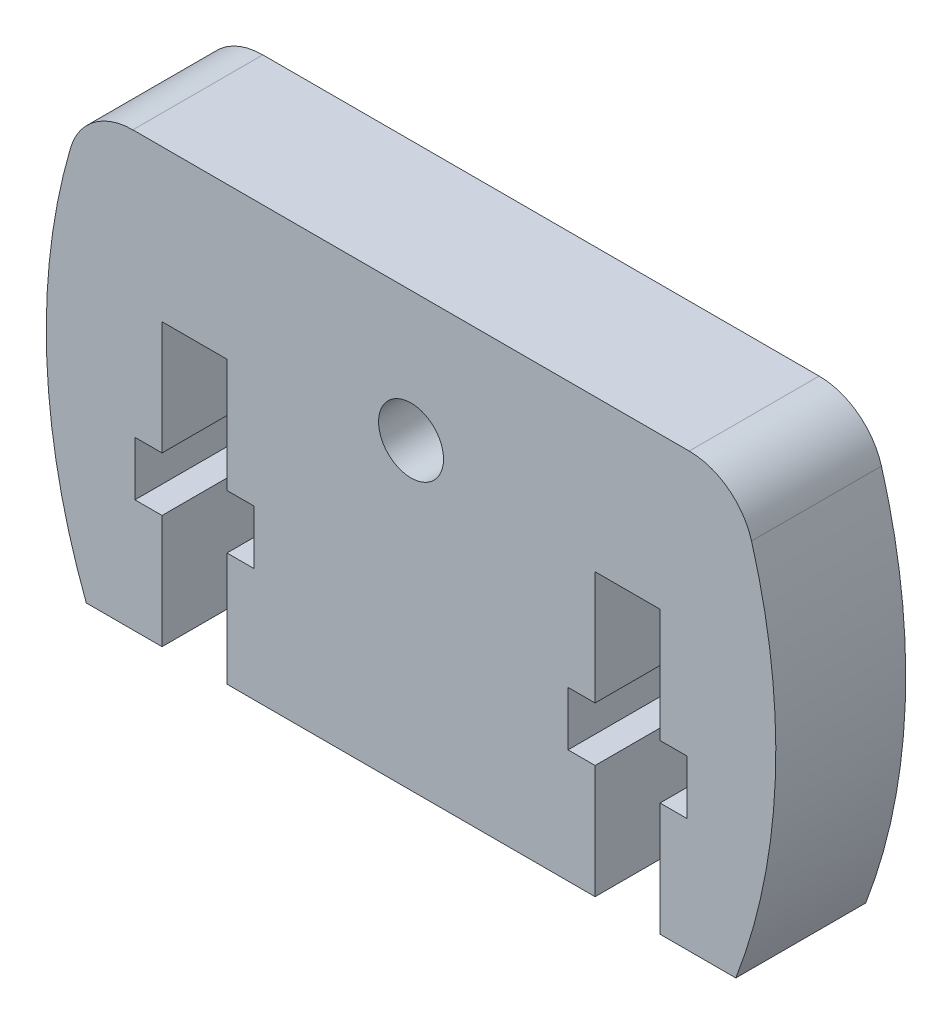
ISO-10303-21;
HEADER;
FILE_DESCRIPTION(('STEP AP214'),'2;1');
FILE_NAME('part.step','',(''),(''),'','','');
FILE_SCHEMA(('AUTOMOTIVE_DESIGN { 1 0 10303 214 1 1 1 1 }'));
ENDSEC;
DATA;
#1=APPLICATION_CONTEXT('core data for automotive mechanical design processes');
#2=APPLICATION_PROTOCOL_DEFINITION('international standard','automotive_design',2000,#1);
#3=PRODUCT_CONTEXT('',#1,'mechanical');
#4=PRODUCT('Part','Part','',(#3));
#5=PRODUCT_RELATED_PRODUCT_CATEGORY('part','',(#4));
#6=PRODUCT_DEFINITION_FORMATION('','',#4);
#7=PRODUCT_DEFINITION_CONTEXT('part definition',#1,'design');
#8=PRODUCT_DEFINITION('design','',#6,#7);
#9=PRODUCT_DEFINITION_SHAPE('','',#8);
#10=(LENGTH_UNIT() NAMED_UNIT(*) SI_UNIT(.MILLI.,.METRE.));
#11=(NAMED_UNIT(*) PLANE_ANGLE_UNIT() SI_UNIT($,.RADIAN.));
#12=(NAMED_UNIT(*) SI_UNIT($,.STERADIAN.) SOLID_ANGLE_UNIT());
#13=UNCERTAINTY_MEASURE_WITH_UNIT(LENGTH_MEASURE(1.E-05),#10,'distance_accuracy_value','');
#14=(GEOMETRIC_REPRESENTATION_CONTEXT(3) GLOBAL_UNCERTAINTY_ASSIGNED_CONTEXT((#13)) GLOBAL_UNIT_ASSIGNED_CONTEXT((#10,
#11,#12)) REPRESENTATION_CONTEXT('',''));
#15=CARTESIAN_POINT('',(0.,0.,0.));
#16=DIRECTION('',(0.,0.,1.));
#17=DIRECTION('',(1.,0.,0.));
#18=AXIS2_PLACEMENT_3D('',#15,#16,#17);
#19=CARTESIAN_POINT('',(26.1482162698119,10.,6.));
#20=DIRECTION('',(0.,0.,-1.));
#21=DIRECTION('',(-1.,0.,0.));
#22=AXIS2_PLACEMENT_3D('',#19,#20,#21);
#23=PLANE('',#22);
#24=CARTESIAN_POINT('',(26.1482162698119,10.,6.));
#25=DIRECTION('',(0.,0.,1.));
#26=DIRECTION('',(-1.,0.,0.));
#27=AXIS2_PLACEMENT_3D('',#24,#25,#26);
#28=CIRCLE('',#27,27.99516411977);
#29=CARTESIAN_POINT('',(-0.726698907722935,17.8401625170122,6.));
#30=VERTEX_POINT('',#29);
#31=CARTESIAN_POINT('',(0.,0.,6.));
#32=VERTEX_POINT('',#31);
#33=EDGE_CURVE('E362',#30,#32,#28,.T.);
#34=ORIENTED_EDGE('',*,*,#33,.T.);
#35=DIRECTION('',(1.,0.,0.));
#36=VECTOR('',#35,1.);
#37=CARTESIAN_POINT('',(0.,0.,6.));
#38=LINE('',#37,#36);
#39=CARTESIAN_POINT('',(3.5,0.,6.));
#40=VERTEX_POINT('',#39);
#41=EDGE_CURVE('E166',#32,#40,#38,.T.);
#42=ORIENTED_EDGE('',*,*,#41,.T.);
#43=DIRECTION('',(0.,1.,0.));
#44=VECTOR('',#43,1.);
#45=CARTESIAN_POINT('',(3.5,0.,6.));
#46=LINE('',#45,#44);
#47=CARTESIAN_POINT('',(3.5,5.25,6.));
#48=VERTEX_POINT('',#47);
#49=EDGE_CURVE('E471',#40,#48,#46,.T.);
#50=ORIENTED_EDGE('',*,*,#49,.T.);
#51=DIRECTION('',(-1.,0.,0.));
#52=VECTOR('',#51,1.);
#53=CARTESIAN_POINT('',(3.5,5.25,6.));
#54=LINE('',#53,#52);
#55=CARTESIAN_POINT('',(2.25,5.25,6.));
#56=VERTEX_POINT('',#55);
#57=EDGE_CURVE('E491',#48,#56,#54,.T.);
#58=ORIENTED_EDGE('',*,*,#57,.T.);
#59=DIRECTION('',(0.,1.,0.));
#60=VECTOR('',#59,1.);
#61=CARTESIAN_POINT('',(2.25,5.25,6.));
#62=LINE('',#61,#60);
#63=CARTESIAN_POINT('',(2.25,7.75,6.));
#64=VERTEX_POINT('',#63);
#65=EDGE_CURVE('E487',#56,#64,#62,.T.);
#66=ORIENTED_EDGE('',*,*,#65,.T.);
#67=DIRECTION('',(1.,0.,0.));
#68=VECTOR('',#67,1.);
#69=CARTESIAN_POINT('',(2.25,7.75,6.));
#70=LINE('',#69,#68);
#71=CARTESIAN_POINT('',(3.5,7.75,6.));
#72=VERTEX_POINT('',#71);
#73=EDGE_CURVE('E490',#64,#72,#70,.T.);
#74=ORIENTED_EDGE('',*,*,#73,.T.);
#75=DIRECTION('',(0.,1.,0.));
#76=VECTOR('',#75,1.);
#77=CARTESIAN_POINT('',(3.5,7.75,6.));
#78=LINE('',#77,#76);
#79=CARTESIAN_POINT('',(3.5,13.,6.));
#80=VERTEX_POINT('',#79);
#81=EDGE_CURVE('E495',#72,#80,#78,.T.);
#82=ORIENTED_EDGE('',*,*,#81,.T.);
#83=DIRECTION('',(1.,0.,0.));
#84=VECTOR('',#83,1.);
#85=CARTESIAN_POINT('',(3.5,13.,6.));
#86=LINE('',#85,#84);
#87=CARTESIAN_POINT('',(6.5,13.,6.));
#88=VERTEX_POINT('',#87);
#89=EDGE_CURVE('E502',#80,#88,#86,.T.);
#90=ORIENTED_EDGE('',*,*,#89,.T.);
#91=DIRECTION('',(0.,-1.,0.));
#92=VECTOR('',#91,1.);
#93=CARTESIAN_POINT('',(6.5,7.75,6.));
#94=LINE('',#93,#92);
#95=CARTESIAN_POINT('',(6.5,7.75,6.));
#96=VERTEX_POINT('',#95);
#97=EDGE_CURVE('E505',#88,#96,#94,.T.);
#98=ORIENTED_EDGE('',*,*,#97,.T.);
#99=DIRECTION('',(1.,0.,0.));
#100=VECTOR('',#99,1.);
#101=CARTESIAN_POINT('',(7.75,7.75,6.));
#102=LINE('',#101,#100);
#103=CARTESIAN_POINT('',(7.75,7.75,6.));
#104=VERTEX_POINT('',#103);
#105=EDGE_CURVE('E508',#96,#104,#102,.T.);
#106=ORIENTED_EDGE('',*,*,#105,.T.);
#107=DIRECTION('',(0.,-1.,0.));
#108=VECTOR('',#107,1.);
#109=CARTESIAN_POINT('',(7.75,5.25,6.));
#110=LINE('',#109,#108);
#111=CARTESIAN_POINT('',(7.75,5.25,6.));
#112=VERTEX_POINT('',#111);
#113=EDGE_CURVE('E511',#104,#112,#110,.T.);
#114=ORIENTED_EDGE('',*,*,#113,.T.);
#115=DIRECTION('',(-1.,0.,0.));
#116=VECTOR('',#115,1.);
#117=CARTESIAN_POINT('',(6.5,5.25,6.));
#118=LINE('',#117,#116);
#119=CARTESIAN_POINT('',(6.5,5.25,6.));
#120=VERTEX_POINT('',#119);
#121=EDGE_CURVE('E514',#112,#120,#118,.T.);
#122=ORIENTED_EDGE('',*,*,#121,.T.);
#123=DIRECTION('',(0.,-1.,0.));
#124=VECTOR('',#123,1.);
#125=CARTESIAN_POINT('',(6.5,0.,6.));
#126=LINE('',#125,#124);
#127=CARTESIAN_POINT('',(6.5,0.,6.));
#128=VERTEX_POINT('',#127);
#129=EDGE_CURVE('E517',#120,#128,#126,.T.);
#130=ORIENTED_EDGE('',*,*,#129,.T.);
#131=DIRECTION('',(1.,0.,0.));
#132=VECTOR('',#131,1.);
#133=CARTESIAN_POINT('',(6.5,0.,6.));
#134=LINE('',#133,#132);
#135=CARTESIAN_POINT('',(23.5,0.,6.));
#136=VERTEX_POINT('',#135);
#137=EDGE_CURVE('E520',#128,#136,#134,.T.);
#138=ORIENTED_EDGE('',*,*,#137,.T.);
#139=DIRECTION('',(0.,1.,0.));
#140=VECTOR('',#139,1.);
#141=CARTESIAN_POINT('',(23.5,0.,6.));
#142=LINE('',#141,#140);
#143=CARTESIAN_POINT('',(23.5,5.25,6.));
#144=VERTEX_POINT('',#143);
#145=EDGE_CURVE('E523',#136,#144,#142,.T.);
#146=ORIENTED_EDGE('',*,*,#145,.T.);
#147=DIRECTION('',(-1.,0.,0.));
#148=VECTOR('',#147,1.);
#149=CARTESIAN_POINT('',(23.5,5.25,6.));
#150=LINE('',#149,#148);
#151=CARTESIAN_POINT('',(22.25,5.25,6.));
#152=VERTEX_POINT('',#151);
#153=EDGE_CURVE('E526',#144,#152,#150,.T.);
#154=ORIENTED_EDGE('',*,*,#153,.T.);
#155=DIRECTION('',(0.,1.,0.));
#156=VECTOR('',#155,1.);
#157=CARTESIAN_POINT('',(22.25,5.25,6.));
#158=LINE('',#157,#156);
#159=CARTESIAN_POINT('',(22.25,7.75,6.));
#160=VERTEX_POINT('',#159);
#161=EDGE_CURVE('E529',#152,#160,#158,.T.);
#162=ORIENTED_EDGE('',*,*,#161,.T.);
#163=DIRECTION('',(1.,0.,0.));
#164=VECTOR('',#163,1.);
#165=CARTESIAN_POINT('',(22.25,7.75,6.));
#166=LINE('',#165,#164);
#167=CARTESIAN_POINT('',(23.5,7.75,6.));
#168=VERTEX_POINT('',#167);
#169=EDGE_CURVE('E532',#160,#168,#166,.T.);
#170=ORIENTED_EDGE('',*,*,#169,.T.);
#171=DIRECTION('',(0.,1.,0.));
#172=VECTOR('',#171,1.);
#173=CARTESIAN_POINT('',(23.5,7.75,6.));
#174=LINE('',#173,#172);
#175=CARTESIAN_POINT('',(23.5,13.,6.));
#176=VERTEX_POINT('',#175);
#177=EDGE_CURVE('E535',#168,#176,#174,.T.);
#178=ORIENTED_EDGE('',*,*,#177,.T.);
#179=DIRECTION('',(1.,0.,0.));
#180=VECTOR('',#179,1.);
#181=CARTESIAN_POINT('',(26.5,13.,6.));
#182=LINE('',#181,#180);
#183=CARTESIAN_POINT('',(26.5,13.,6.));
#184=VERTEX_POINT('',#183);
#185=EDGE_CURVE('E538',#176,#184,#182,.T.);
#186=ORIENTED_EDGE('',*,*,#185,.T.);
#187=DIRECTION('',(0.,-1.,0.));
#188=VECTOR('',#187,1.);
#189=CARTESIAN_POINT('',(26.5,7.75,6.));
#190=LINE('',#189,#188);
#191=CARTESIAN_POINT('',(26.5,7.75,6.));
#192=VERTEX_POINT('',#191);
#193=EDGE_CURVE('E541',#184,#192,#190,.T.);
#194=ORIENTED_EDGE('',*,*,#193,.T.);
#195=DIRECTION('',(1.,0.,0.));
#196=VECTOR('',#195,1.);
#197=CARTESIAN_POINT('',(27.75,7.75,6.));
#198=LINE('',#197,#196);
#199=CARTESIAN_POINT('',(27.75,7.75,6.));
#200=VERTEX_POINT('',#199);
#201=EDGE_CURVE('E544',#192,#200,#198,.T.);
#202=ORIENTED_EDGE('',*,*,#201,.T.);
#203=DIRECTION('',(0.,-1.,0.));
#204=VECTOR('',#203,1.);
#205=CARTESIAN_POINT('',(27.75,5.25,6.));
#206=LINE('',#205,#204);
#207=CARTESIAN_POINT('',(27.75,5.25,6.));
#208=VERTEX_POINT('',#207);
#209=EDGE_CURVE('E547',#200,#208,#206,.T.);
#210=ORIENTED_EDGE('',*,*,#209,.T.);
#211=DIRECTION('',(-1.,0.,0.));
#212=VECTOR('',#211,1.);
#213=CARTESIAN_POINT('',(26.5,5.25,6.));
#214=LINE('',#213,#212);
#215=CARTESIAN_POINT('',(26.5,5.25,6.));
#216=VERTEX_POINT('',#215);
#217=EDGE_CURVE('E550',#208,#216,#214,.T.);
#218=ORIENTED_EDGE('',*,*,#217,.T.);
#219=DIRECTION('',(0.,-1.,0.));
#220=VECTOR('',#219,1.);
#221=CARTESIAN_POINT('',(26.5,0.,6.));
#222=LINE('',#221,#220);
#223=CARTESIAN_POINT('',(26.5,0.,6.));
#224=VERTEX_POINT('',#223);
#225=EDGE_CURVE('E553',#216,#224,#222,.T.);
#226=ORIENTED_EDGE('',*,*,#225,.T.);
#227=DIRECTION('',(1.,0.,0.));
#228=VECTOR('',#227,1.);
#229=CARTESIAN_POINT('',(26.5,0.,6.));
#230=LINE('',#229,#228);
#231=CARTESIAN_POINT('',(30.,0.,6.));
#232=VERTEX_POINT('',#231);
#233=EDGE_CURVE('E556',#224,#232,#230,.T.);
#234=ORIENTED_EDGE('',*,*,#233,.T.);
#235=CARTESIAN_POINT('',(3.85178373018806,10.,6.));
#236=DIRECTION('',(0.,0.,1.));
#237=DIRECTION('',(1.,0.,0.));
#238=AXIS2_PLACEMENT_3D('',#235,#236,#237);
#239=CIRCLE('',#238,27.99516411977);
#240=CARTESIAN_POINT('',(30.7266989077229,17.8401625170122,6.));
#241=VERTEX_POINT('',#240);
#242=EDGE_CURVE('E251',#232,#241,#239,.T.);
#243=ORIENTED_EDGE('',*,*,#242,.T.);
#244=CARTESIAN_POINT('',(27.8467463134937,17.,6.));
#245=DIRECTION('',(0.,0.,1.));
#246=DIRECTION('',(-1.,0.,0.));
#247=AXIS2_PLACEMENT_3D('',#244,#245,#246);
#248=CIRCLE('',#247,3.);
#249=CARTESIAN_POINT('',(27.8467463134937,20.,6.));
#250=VERTEX_POINT('',#249);
#251=EDGE_CURVE('E245',#241,#250,#248,.T.);
#252=ORIENTED_EDGE('',*,*,#251,.T.);
#253=DIRECTION('',(-1.,0.,0.));
#254=VECTOR('',#253,1.);
#255=CARTESIAN_POINT('',(2.15325368650629,20.,6.));
#256=LINE('',#255,#254);
#257=CARTESIAN_POINT('',(2.15325368650629,20.,6.));
#258=VERTEX_POINT('',#257);
#259=EDGE_CURVE('E249',#250,#258,#256,.T.);
#260=ORIENTED_EDGE('',*,*,#259,.T.);
#261=CARTESIAN_POINT('',(2.15325368650629,17.,6.));
#262=DIRECTION('',(0.,0.,1.));
#263=DIRECTION('',(1.,0.,0.));
#264=AXIS2_PLACEMENT_3D('',#261,#262,#263);
#265=CIRCLE('',#264,3.);
#266=EDGE_CURVE('E57',#258,#30,#265,.T.);
#267=ORIENTED_EDGE('',*,*,#266,.T.);
#268=EDGE_LOOP('',(#34,#42,#50,#58,#66,#74,#82,#90,#98,#106,#114,#122,#130,#138,#146,#154,#162,
#170,#178,#186,#194,#202,#210,#218,#226,#234,#243,#252,#260,#267));
#269=FACE_BOUND('',#268,.T.);
#270=CARTESIAN_POINT('',(15.,14.,6.));
#271=DIRECTION('',(0.,0.,1.));
#272=DIRECTION('',(1.,0.,0.));
#273=AXIS2_PLACEMENT_3D('',#270,#271,#272);
#274=CIRCLE('',#273,1.5);
#275=CARTESIAN_POINT('',(16.5,14.,6.));
#276=VERTEX_POINT('',#275);
#277=EDGE_CURVE('E278',#276,#276,#274,.T.);
#278=ORIENTED_EDGE('',*,*,#277,.F.);
#279=EDGE_LOOP('',(#278));
#280=FACE_BOUND('',#279,.T.);
#281=ADVANCED_FACE('F39',(#269,#280),#23,.F.);
#282=CARTESIAN_POINT('',(26.1482162698119,10.,0.));
#283=DIRECTION('',(0.,0.,-1.));
#284=DIRECTION('',(-1.,0.,0.));
#285=AXIS2_PLACEMENT_3D('',#282,#283,#284);
#286=PLANE('',#285);
#287=CARTESIAN_POINT('',(26.1482162698119,10.,0.));
#288=DIRECTION('',(0.,0.,1.));
#289=DIRECTION('',(-1.,0.,0.));
#290=AXIS2_PLACEMENT_3D('',#287,#288,#289);
#291=CIRCLE('',#290,27.99516411977);
#292=CARTESIAN_POINT('',(-0.726698907722935,17.8401625170122,0.));
#293=VERTEX_POINT('',#292);
#294=CARTESIAN_POINT('',(0.,0.,0.));
#295=VERTEX_POINT('',#294);
#296=EDGE_CURVE('E273',#293,#295,#291,.T.);
#297=ORIENTED_EDGE('',*,*,#296,.F.);
#298=CARTESIAN_POINT('',(2.15325368650629,17.,0.));
#299=DIRECTION('',(0.,0.,1.));
#300=DIRECTION('',(1.,0.,0.));
#301=AXIS2_PLACEMENT_3D('',#298,#299,#300);
#302=CIRCLE('',#301,3.);
#303=CARTESIAN_POINT('',(2.15325368650629,20.,0.));
#304=VERTEX_POINT('',#303);
#305=EDGE_CURVE('E158',#304,#293,#302,.T.);
#306=ORIENTED_EDGE('',*,*,#305,.F.);
#307=DIRECTION('',(-1.,0.,0.));
#308=VECTOR('',#307,1.);
#309=CARTESIAN_POINT('',(2.15325368650629,20.,0.));
#310=LINE('',#309,#308);
#311=CARTESIAN_POINT('',(27.8467463134937,20.,0.));
#312=VERTEX_POINT('',#311);
#313=EDGE_CURVE('E152',#312,#304,#310,.T.);
#314=ORIENTED_EDGE('',*,*,#313,.F.);
#315=CARTESIAN_POINT('',(27.8467463134937,17.,0.));
#316=DIRECTION('',(0.,0.,1.));
#317=DIRECTION('',(-1.,0.,0.));
#318=AXIS2_PLACEMENT_3D('',#315,#316,#317);
#319=CIRCLE('',#318,3.);
#320=CARTESIAN_POINT('',(30.7266989077229,17.8401625170122,0.));
#321=VERTEX_POINT('',#320);
#322=EDGE_CURVE('E260',#321,#312,#319,.T.);
#323=ORIENTED_EDGE('',*,*,#322,.F.);
#324=CARTESIAN_POINT('',(3.85178373018806,10.,0.));
#325=DIRECTION('',(0.,0.,1.));
#326=DIRECTION('',(1.,0.,0.));
#327=AXIS2_PLACEMENT_3D('',#324,#325,#326);
#328=CIRCLE('',#327,27.99516411977);
#329=CARTESIAN_POINT('',(30.,0.,0.));
#330=VERTEX_POINT('',#329);
#331=EDGE_CURVE('E353',#330,#321,#328,.T.);
#332=ORIENTED_EDGE('',*,*,#331,.F.);
#333=DIRECTION('',(1.,0.,0.));
#334=VECTOR('',#333,1.);
#335=CARTESIAN_POINT('',(26.5,0.,0.));
#336=LINE('',#335,#334);
#337=CARTESIAN_POINT('',(26.5,0.,0.));
#338=VERTEX_POINT('',#337);
#339=EDGE_CURVE('E350',#338,#330,#336,.T.);
#340=ORIENTED_EDGE('',*,*,#339,.F.);
#341=DIRECTION('',(0.,-1.,0.));
#342=VECTOR('',#341,1.);
#343=CARTESIAN_POINT('',(26.5,0.,0.));
#344=LINE('',#343,#342);
#345=CARTESIAN_POINT('',(26.5,5.25,0.));
#346=VERTEX_POINT('',#345);
#347=EDGE_CURVE('E347',#346,#338,#344,.T.);
#348=ORIENTED_EDGE('',*,*,#347,.F.);
#349=DIRECTION('',(-1.,0.,0.));
#350=VECTOR('',#349,1.);
#351=CARTESIAN_POINT('',(26.5,5.25,0.));
#352=LINE('',#351,#350);
#353=CARTESIAN_POINT('',(27.75,5.25,0.));
#354=VERTEX_POINT('',#353);
#355=EDGE_CURVE('E344',#354,#346,#352,.T.);
#356=ORIENTED_EDGE('',*,*,#355,.F.);
#357=DIRECTION('',(0.,-1.,0.));
#358=VECTOR('',#357,1.);
#359=CARTESIAN_POINT('',(27.75,5.25,0.));
#360=LINE('',#359,#358);
#361=CARTESIAN_POINT('',(27.75,7.75,0.));
#362=VERTEX_POINT('',#361);
#363=EDGE_CURVE('E341',#362,#354,#360,.T.);
#364=ORIENTED_EDGE('',*,*,#363,.F.);
#365=DIRECTION('',(1.,0.,0.));
#366=VECTOR('',#365,1.);
#367=CARTESIAN_POINT('',(27.75,7.75,0.));
#368=LINE('',#367,#366);
#369=CARTESIAN_POINT('',(26.5,7.75,0.));
#370=VERTEX_POINT('',#369);
#371=EDGE_CURVE('E338',#370,#362,#368,.T.);
#372=ORIENTED_EDGE('',*,*,#371,.F.);
#373=DIRECTION('',(0.,-1.,0.));
#374=VECTOR('',#373,1.);
#375=CARTESIAN_POINT('',(26.5,7.75,0.));
#376=LINE('',#375,#374);
#377=CARTESIAN_POINT('',(26.5,13.,0.));
#378=VERTEX_POINT('',#377);
#379=EDGE_CURVE('E335',#378,#370,#376,.T.);
#380=ORIENTED_EDGE('',*,*,#379,.F.);
#381=DIRECTION('',(1.,0.,0.));
#382=VECTOR('',#381,1.);
#383=CARTESIAN_POINT('',(26.5,13.,0.));
#384=LINE('',#383,#382);
#385=CARTESIAN_POINT('',(23.5,13.,0.));
#386=VERTEX_POINT('',#385);
#387=EDGE_CURVE('E332',#386,#378,#384,.T.);
#388=ORIENTED_EDGE('',*,*,#387,.F.);
#389=DIRECTION('',(0.,1.,0.));
#390=VECTOR('',#389,1.);
#391=CARTESIAN_POINT('',(23.5,7.75,0.));
#392=LINE('',#391,#390);
#393=CARTESIAN_POINT('',(23.5,7.75,0.));
#394=VERTEX_POINT('',#393);
#395=EDGE_CURVE('E329',#394,#386,#392,.T.);
#396=ORIENTED_EDGE('',*,*,#395,.F.);
#397=DIRECTION('',(1.,0.,0.));
#398=VECTOR('',#397,1.);
#399=CARTESIAN_POINT('',(22.25,7.75,0.));
#400=LINE('',#399,#398);
#401=CARTESIAN_POINT('',(22.25,7.75,0.));
#402=VERTEX_POINT('',#401);
#403=EDGE_CURVE('E326',#402,#394,#400,.T.);
#404=ORIENTED_EDGE('',*,*,#403,.F.);
#405=DIRECTION('',(0.,1.,0.));
#406=VECTOR('',#405,1.);
#407=CARTESIAN_POINT('',(22.25,5.25,0.));
#408=LINE('',#407,#406);
#409=CARTESIAN_POINT('',(22.25,5.25,0.));
#410=VERTEX_POINT('',#409);
#411=EDGE_CURVE('E323',#410,#402,#408,.T.);
#412=ORIENTED_EDGE('',*,*,#411,.F.);
#413=DIRECTION('',(-1.,0.,0.));
#414=VECTOR('',#413,1.);
#415=CARTESIAN_POINT('',(23.5,5.25,0.));
#416=LINE('',#415,#414);
#417=CARTESIAN_POINT('',(23.5,5.25,0.));
#418=VERTEX_POINT('',#417);
#419=EDGE_CURVE('E320',#418,#410,#416,.T.);
#420=ORIENTED_EDGE('',*,*,#419,.F.);
#421=DIRECTION('',(0.,1.,0.));
#422=VECTOR('',#421,1.);
#423=CARTESIAN_POINT('',(23.5,0.,0.));
#424=LINE('',#423,#422);
#425=CARTESIAN_POINT('',(23.5,0.,0.));
#426=VERTEX_POINT('',#425);
#427=EDGE_CURVE('E317',#426,#418,#424,.T.);
#428=ORIENTED_EDGE('',*,*,#427,.F.);
#429=DIRECTION('',(1.,0.,0.));
#430=VECTOR('',#429,1.);
#431=CARTESIAN_POINT('',(6.5,0.,0.));
#432=LINE('',#431,#430);
#433=CARTESIAN_POINT('',(6.5,0.,0.));
#434=VERTEX_POINT('',#433);
#435=EDGE_CURVE('E314',#434,#426,#432,.T.);
#436=ORIENTED_EDGE('',*,*,#435,.F.);
#437=DIRECTION('',(0.,-1.,0.));
#438=VECTOR('',#437,1.);
#439=CARTESIAN_POINT('',(6.5,0.,0.));
#440=LINE('',#439,#438);
#441=CARTESIAN_POINT('',(6.5,5.25,0.));
#442=VERTEX_POINT('',#441);
#443=EDGE_CURVE('E311',#442,#434,#440,.T.);
#444=ORIENTED_EDGE('',*,*,#443,.F.);
#445=DIRECTION('',(-1.,0.,0.));
#446=VECTOR('',#445,1.);
#447=CARTESIAN_POINT('',(6.5,5.25,0.));
#448=LINE('',#447,#446);
#449=CARTESIAN_POINT('',(7.75,5.25,0.));
#450=VERTEX_POINT('',#449);
#451=EDGE_CURVE('E308',#450,#442,#448,.T.);
#452=ORIENTED_EDGE('',*,*,#451,.F.);
#453=DIRECTION('',(0.,-1.,0.));
#454=VECTOR('',#453,1.);
#455=CARTESIAN_POINT('',(7.75,5.25,0.));
#456=LINE('',#455,#454);
#457=CARTESIAN_POINT('',(7.75,7.75,0.));
#458=VERTEX_POINT('',#457);
#459=EDGE_CURVE('E305',#458,#450,#456,.T.);
#460=ORIENTED_EDGE('',*,*,#459,.F.);
#461=DIRECTION('',(1.,0.,0.));
#462=VECTOR('',#461,1.);
#463=CARTESIAN_POINT('',(7.75,7.75,0.));
#464=LINE('',#463,#462);
#465=CARTESIAN_POINT('',(6.5,7.75,0.));
#466=VERTEX_POINT('',#465);
#467=EDGE_CURVE('E302',#466,#458,#464,.T.);
#468=ORIENTED_EDGE('',*,*,#467,.F.);
#469=DIRECTION('',(0.,-1.,0.));
#470=VECTOR('',#469,1.);
#471=CARTESIAN_POINT('',(6.5,7.75,0.));
#472=LINE('',#471,#470);
#473=CARTESIAN_POINT('',(6.5,13.,0.));
#474=VERTEX_POINT('',#473);
#475=EDGE_CURVE('E299',#474,#466,#472,.T.);
#476=ORIENTED_EDGE('',*,*,#475,.F.);
#477=DIRECTION('',(1.,0.,0.));
#478=VECTOR('',#477,1.);
#479=CARTESIAN_POINT('',(3.5,13.,0.));
#480=LINE('',#479,#478);
#481=CARTESIAN_POINT('',(3.5,13.,0.));
#482=VERTEX_POINT('',#481);
#483=EDGE_CURVE('E296',#482,#474,#480,.T.);
#484=ORIENTED_EDGE('',*,*,#483,.F.);
#485=DIRECTION('',(0.,1.,0.));
#486=VECTOR('',#485,1.);
#487=CARTESIAN_POINT('',(3.5,7.75,0.));
#488=LINE('',#487,#486);
#489=CARTESIAN_POINT('',(3.5,7.75,0.));
#490=VERTEX_POINT('',#489);
#491=EDGE_CURVE('E293',#490,#482,#488,.T.);
#492=ORIENTED_EDGE('',*,*,#491,.F.);
#493=DIRECTION('',(1.,0.,0.));
#494=VECTOR('',#493,1.);
#495=CARTESIAN_POINT('',(2.25,7.75,0.));
#496=LINE('',#495,#494);
#497=CARTESIAN_POINT('',(2.25,7.75,0.));
#498=VERTEX_POINT('',#497);
#499=EDGE_CURVE('E290',#498,#490,#496,.T.);
#500=ORIENTED_EDGE('',*,*,#499,.F.);
#501=DIRECTION('',(0.,1.,0.));
#502=VECTOR('',#501,1.);
#503=CARTESIAN_POINT('',(2.25,5.25,0.));
#504=LINE('',#503,#502);
#505=CARTESIAN_POINT('',(2.25,5.25,0.));
#506=VERTEX_POINT('',#505);
#507=EDGE_CURVE('E287',#506,#498,#504,.T.);
#508=ORIENTED_EDGE('',*,*,#507,.F.);
#509=DIRECTION('',(-1.,0.,0.));
#510=VECTOR('',#509,1.);
#511=CARTESIAN_POINT('',(3.5,5.25,0.));
#512=LINE('',#511,#510);
#513=CARTESIAN_POINT('',(3.5,5.25,0.));
#514=VERTEX_POINT('',#513);
#515=EDGE_CURVE('E284',#514,#506,#512,.T.);
#516=ORIENTED_EDGE('',*,*,#515,.F.);
#517=DIRECTION('',(0.,1.,0.));
#518=VECTOR('',#517,1.);
#519=CARTESIAN_POINT('',(3.5,0.,0.));
#520=LINE('',#519,#518);
#521=CARTESIAN_POINT('',(3.5,0.,0.));
#522=VERTEX_POINT('',#521);
#523=EDGE_CURVE('E281',#522,#514,#520,.T.);
#524=ORIENTED_EDGE('',*,*,#523,.F.);
#525=DIRECTION('',(1.,0.,0.));
#526=VECTOR('',#525,1.);
#527=CARTESIAN_POINT('',(0.,0.,0.));
#528=LINE('',#527,#526);
#529=EDGE_CURVE('E277',#295,#522,#528,.T.);
#530=ORIENTED_EDGE('',*,*,#529,.F.);
#531=EDGE_LOOP('',(#297,#306,#314,#323,#332,#340,#348,#356,#364,#372,#380,#388,#396,#404,#412,
#420,#428,#436,#444,#452,#460,#468,#476,#484,#492,#500,#508,#516,#524,#530));
#532=FACE_BOUND('',#531,.T.);
#533=CARTESIAN_POINT('',(15.,14.,0.));
#534=DIRECTION('',(0.,0.,1.));
#535=DIRECTION('',(1.,0.,0.));
#536=AXIS2_PLACEMENT_3D('',#533,#534,#535);
#537=CIRCLE('',#536,1.5);
#538=CARTESIAN_POINT('',(16.5,14.,0.));
#539=VERTEX_POINT('',#538);
#540=EDGE_CURVE('E939',#539,#539,#537,.T.);
#541=ORIENTED_EDGE('',*,*,#540,.T.);
#542=EDGE_LOOP('',(#541));
#543=FACE_BOUND('',#542,.T.);
#544=ADVANCED_FACE('F475',(#532,#543),#286,.T.);
#545=CARTESIAN_POINT('',(26.1482162698119,10.,6.));
#546=DIRECTION('',(0.,0.,-1.));
#547=DIRECTION('',(-1.,0.,0.));
#548=AXIS2_PLACEMENT_3D('',#545,#546,#547);
#549=CYLINDRICAL_SURFACE('',#548,27.99516411977);
#550=ORIENTED_EDGE('',*,*,#296,.T.);
#551=DIRECTION('',(0.,0.,-1.));
#552=VECTOR('',#551,1.);
#553=CARTESIAN_POINT('',(0.,0.,6.));
#554=LINE('',#553,#552);
#555=EDGE_CURVE('E11',#32,#295,#554,.T.);
#556=ORIENTED_EDGE('',*,*,#555,.F.);
#557=ORIENTED_EDGE('',*,*,#33,.F.);
#558=DIRECTION('',(0.,0.,-1.));
#559=VECTOR('',#558,1.);
#560=CARTESIAN_POINT('',(-0.726698907722935,17.8401625170122,6.));
#561=LINE('',#560,#559);
#562=EDGE_CURVE('E269',#30,#293,#561,.T.);
#563=ORIENTED_EDGE('',*,*,#562,.T.);
#564=EDGE_LOOP('',(#550,#556,#557,#563));
#565=FACE_BOUND('',#564,.T.);
#566=ADVANCED_FACE('F41',(#565),#549,.T.);
#567=CARTESIAN_POINT('',(0.,0.,6.));
#568=DIRECTION('',(0.,1.,0.));
#569=DIRECTION('',(-1.,0.,0.));
#570=AXIS2_PLACEMENT_3D('',#567,#568,#569);
#571=PLANE('',#570);
#572=ORIENTED_EDGE('',*,*,#529,.T.);
#573=DIRECTION('',(0.,0.,-1.));
#574=VECTOR('',#573,1.);
#575=CARTESIAN_POINT('',(3.5,0.,6.));
#576=LINE('',#575,#574);
#577=EDGE_CURVE('E49',#40,#522,#576,.T.);
#578=ORIENTED_EDGE('',*,*,#577,.F.);
#579=ORIENTED_EDGE('',*,*,#41,.F.);
#580=ORIENTED_EDGE('',*,*,#555,.T.);
#581=EDGE_LOOP('',(#572,#578,#579,#580));
#582=FACE_BOUND('',#581,.T.);
#583=ADVANCED_FACE('F592',(#582),#571,.F.);
#584=CARTESIAN_POINT('',(3.5,0.,6.));
#585=DIRECTION('',(-1.,0.,0.));
#586=DIRECTION('',(0.,0.,1.));
#587=AXIS2_PLACEMENT_3D('',#584,#585,#586);
#588=PLANE('',#587);
#589=ORIENTED_EDGE('',*,*,#523,.T.);
#590=DIRECTION('',(0.,0.,-1.));
#591=VECTOR('',#590,1.);
#592=CARTESIAN_POINT('',(3.5,5.25,6.));
#593=LINE('',#592,#591);
#594=EDGE_CURVE('E461',#48,#514,#593,.T.);
#595=ORIENTED_EDGE('',*,*,#594,.F.);
#596=ORIENTED_EDGE('',*,*,#49,.F.);
#597=ORIENTED_EDGE('',*,*,#577,.T.);
#598=EDGE_LOOP('',(#589,#595,#596,#597));
#599=FACE_BOUND('',#598,.T.);
#600=ADVANCED_FACE('F469',(#599),#588,.F.);
#601=CARTESIAN_POINT('',(3.5,5.25,6.));
#602=DIRECTION('',(0.,-1.,0.));
#603=DIRECTION('',(0.,0.,-1.));
#604=AXIS2_PLACEMENT_3D('',#601,#602,#603);
#605=PLANE('',#604);
#606=ORIENTED_EDGE('',*,*,#515,.T.);
#607=DIRECTION('',(0.,0.,-1.));
#608=VECTOR('',#607,1.);
#609=CARTESIAN_POINT('',(2.25,5.25,6.));
#610=LINE('',#609,#608);
#611=EDGE_CURVE('E457',#56,#506,#610,.T.);
#612=ORIENTED_EDGE('',*,*,#611,.F.);
#613=ORIENTED_EDGE('',*,*,#57,.F.);
#614=ORIENTED_EDGE('',*,*,#594,.T.);
#615=EDGE_LOOP('',(#606,#612,#613,#614));
#616=FACE_BOUND('',#615,.T.);
#617=ADVANCED_FACE('F481',(#616),#605,.F.);
#618=CARTESIAN_POINT('',(2.25,5.25,6.));
#619=DIRECTION('',(-1.,0.,0.));
#620=DIRECTION('',(0.,0.,1.));
#621=AXIS2_PLACEMENT_3D('',#618,#619,#620);
#622=PLANE('',#621);
#623=ORIENTED_EDGE('',*,*,#507,.T.);
#624=DIRECTION('',(0.,0.,-1.));
#625=VECTOR('',#624,1.);
#626=CARTESIAN_POINT('',(2.25,7.75,6.));
#627=LINE('',#626,#625);
#628=EDGE_CURVE('E453',#64,#498,#627,.T.);
#629=ORIENTED_EDGE('',*,*,#628,.F.);
#630=ORIENTED_EDGE('',*,*,#65,.F.);
#631=ORIENTED_EDGE('',*,*,#611,.T.);
#632=EDGE_LOOP('',(#623,#629,#630,#631));
#633=FACE_BOUND('',#632,.T.);
#634=ADVANCED_FACE('F485',(#633),#622,.F.);
#635=CARTESIAN_POINT('',(2.25,7.75,6.));
#636=DIRECTION('',(0.,1.,0.));
#637=DIRECTION('',(0.,0.,1.));
#638=AXIS2_PLACEMENT_3D('',#635,#636,#637);
#639=PLANE('',#638);
#640=ORIENTED_EDGE('',*,*,#499,.T.);
#641=DIRECTION('',(0.,0.,-1.));
#642=VECTOR('',#641,1.);
#643=CARTESIAN_POINT('',(3.5,7.75,6.));
#644=LINE('',#643,#642);
#645=EDGE_CURVE('E449',#72,#490,#644,.T.);
#646=ORIENTED_EDGE('',*,*,#645,.F.);
#647=ORIENTED_EDGE('',*,*,#73,.F.);
#648=ORIENTED_EDGE('',*,*,#628,.T.);
#649=EDGE_LOOP('',(#640,#646,#647,#648));
#650=FACE_BOUND('',#649,.T.);
#651=ADVANCED_FACE('F605',(#650),#639,.F.);
#652=CARTESIAN_POINT('',(3.5,7.75,6.));
#653=DIRECTION('',(-1.,0.,0.));
#654=DIRECTION('',(0.,0.,1.));
#655=AXIS2_PLACEMENT_3D('',#652,#653,#654);
#656=PLANE('',#655);
#657=ORIENTED_EDGE('',*,*,#491,.T.);
#658=DIRECTION('',(0.,0.,-1.));
#659=VECTOR('',#658,1.);
#660=CARTESIAN_POINT('',(3.5,13.,6.));
#661=LINE('',#660,#659);
#662=EDGE_CURVE('E445',#80,#482,#661,.T.);
#663=ORIENTED_EDGE('',*,*,#662,.F.);
#664=ORIENTED_EDGE('',*,*,#81,.F.);
#665=ORIENTED_EDGE('',*,*,#645,.T.);
#666=EDGE_LOOP('',(#657,#663,#664,#665));
#667=FACE_BOUND('',#666,.T.);
#668=ADVANCED_FACE('F608',(#667),#656,.F.);
#669=CARTESIAN_POINT('',(3.5,13.,6.));
#670=DIRECTION('',(0.,1.,0.));
#671=DIRECTION('',(0.,0.,1.));
#672=AXIS2_PLACEMENT_3D('',#669,#670,#671);
#673=PLANE('',#672);
#674=ORIENTED_EDGE('',*,*,#483,.T.);
#675=DIRECTION('',(0.,0.,-1.));
#676=VECTOR('',#675,1.);
#677=CARTESIAN_POINT('',(6.5,13.,6.));
#678=LINE('',#677,#676);
#679=EDGE_CURVE('E441',#88,#474,#678,.T.);
#680=ORIENTED_EDGE('',*,*,#679,.F.);
#681=ORIENTED_EDGE('',*,*,#89,.F.);
#682=ORIENTED_EDGE('',*,*,#662,.T.);
#683=EDGE_LOOP('',(#674,#680,#681,#682));
#684=FACE_BOUND('',#683,.T.);
#685=ADVANCED_FACE('F612',(#684),#673,.F.);
#686=CARTESIAN_POINT('',(6.5,7.75,6.));
#687=DIRECTION('',(1.,0.,0.));
#688=DIRECTION('',(0.,1.,0.));
#689=AXIS2_PLACEMENT_3D('',#686,#687,#688);
#690=PLANE('',#689);
#691=ORIENTED_EDGE('',*,*,#475,.T.);
#692=DIRECTION('',(0.,0.,-1.));
#693=VECTOR('',#692,1.);
#694=CARTESIAN_POINT('',(6.5,7.75,6.));
#695=LINE('',#694,#693);
#696=EDGE_CURVE('E437',#96,#466,#695,.T.);
#697=ORIENTED_EDGE('',*,*,#696,.F.);
#698=ORIENTED_EDGE('',*,*,#97,.F.);
#699=ORIENTED_EDGE('',*,*,#679,.T.);
#700=EDGE_LOOP('',(#691,#697,#698,#699));
#701=FACE_BOUND('',#700,.T.);
#702=ADVANCED_FACE('F616',(#701),#690,.F.);
#703=CARTESIAN_POINT('',(7.75,7.75,6.));
#704=DIRECTION('',(0.,1.,0.));
#705=DIRECTION('',(0.,0.,1.));
#706=AXIS2_PLACEMENT_3D('',#703,#704,#705);
#707=PLANE('',#706);
#708=ORIENTED_EDGE('',*,*,#467,.T.);
#709=DIRECTION('',(0.,0.,-1.));
#710=VECTOR('',#709,1.);
#711=CARTESIAN_POINT('',(7.75,7.75,6.));
#712=LINE('',#711,#710);
#713=EDGE_CURVE('E433',#104,#458,#712,.T.);
#714=ORIENTED_EDGE('',*,*,#713,.F.);
#715=ORIENTED_EDGE('',*,*,#105,.F.);
#716=ORIENTED_EDGE('',*,*,#696,.T.);
#717=EDGE_LOOP('',(#708,#714,#715,#716));
#718=FACE_BOUND('',#717,.T.);
#719=ADVANCED_FACE('F620',(#718),#707,.F.);
#720=CARTESIAN_POINT('',(7.75,5.25,6.));
#721=DIRECTION('',(1.,0.,0.));
#722=DIRECTION('',(0.,0.,-1.));
#723=AXIS2_PLACEMENT_3D('',#720,#721,#722);
#724=PLANE('',#723);
#725=ORIENTED_EDGE('',*,*,#459,.T.);
#726=DIRECTION('',(0.,0.,-1.));
#727=VECTOR('',#726,1.);
#728=CARTESIAN_POINT('',(7.75,5.25,6.));
#729=LINE('',#728,#727);
#730=EDGE_CURVE('E429',#112,#450,#729,.T.);
#731=ORIENTED_EDGE('',*,*,#730,.F.);
#732=ORIENTED_EDGE('',*,*,#113,.F.);
#733=ORIENTED_EDGE('',*,*,#713,.T.);
#734=EDGE_LOOP('',(#725,#731,#732,#733));
#735=FACE_BOUND('',#734,.T.);
#736=ADVANCED_FACE('F624',(#735),#724,.F.);
#737=CARTESIAN_POINT('',(6.5,5.25,6.));
#738=DIRECTION('',(0.,-1.,0.));
#739=DIRECTION('',(0.,0.,-1.));
#740=AXIS2_PLACEMENT_3D('',#737,#738,#739);
#741=PLANE('',#740);
#742=ORIENTED_EDGE('',*,*,#451,.T.);
#743=DIRECTION('',(0.,0.,-1.));
#744=VECTOR('',#743,1.);
#745=CARTESIAN_POINT('',(6.5,5.25,6.));
#746=LINE('',#745,#744);
#747=EDGE_CURVE('E425',#120,#442,#746,.T.);
#748=ORIENTED_EDGE('',*,*,#747,.F.);
#749=ORIENTED_EDGE('',*,*,#121,.F.);
#750=ORIENTED_EDGE('',*,*,#730,.T.);
#751=EDGE_LOOP('',(#742,#748,#749,#750));
#752=FACE_BOUND('',#751,.T.);
#753=ADVANCED_FACE('F628',(#752),#741,.F.);
#754=CARTESIAN_POINT('',(6.5,0.,6.));
#755=DIRECTION('',(1.,0.,0.));
#756=DIRECTION('',(0.,0.,-1.));
#757=AXIS2_PLACEMENT_3D('',#754,#755,#756);
#758=PLANE('',#757);
#759=ORIENTED_EDGE('',*,*,#443,.T.);
#760=DIRECTION('',(0.,0.,-1.));
#761=VECTOR('',#760,1.);
#762=CARTESIAN_POINT('',(6.5,0.,6.));
#763=LINE('',#762,#761);
#764=EDGE_CURVE('E421',#128,#434,#763,.T.);
#765=ORIENTED_EDGE('',*,*,#764,.F.);
#766=ORIENTED_EDGE('',*,*,#129,.F.);
#767=ORIENTED_EDGE('',*,*,#747,.T.);
#768=EDGE_LOOP('',(#759,#765,#766,#767));
#769=FACE_BOUND('',#768,.T.);
#770=ADVANCED_FACE('F632',(#769),#758,.F.);
#771=CARTESIAN_POINT('',(6.5,0.,6.));
#772=DIRECTION('',(0.,1.,0.));
#773=DIRECTION('',(0.,0.,1.));
#774=AXIS2_PLACEMENT_3D('',#771,#772,#773);
#775=PLANE('',#774);
#776=ORIENTED_EDGE('',*,*,#435,.T.);
#777=DIRECTION('',(0.,0.,-1.));
#778=VECTOR('',#777,1.);
#779=CARTESIAN_POINT('',(23.5,0.,6.));
#780=LINE('',#779,#778);
#781=EDGE_CURVE('E417',#136,#426,#780,.T.);
#782=ORIENTED_EDGE('',*,*,#781,.F.);
#783=ORIENTED_EDGE('',*,*,#137,.F.);
#784=ORIENTED_EDGE('',*,*,#764,.T.);
#785=EDGE_LOOP('',(#776,#782,#783,#784));
#786=FACE_BOUND('',#785,.T.);
#787=ADVANCED_FACE('F636',(#786),#775,.F.);
#788=CARTESIAN_POINT('',(23.5,0.,6.));
#789=DIRECTION('',(-1.,0.,0.));
#790=DIRECTION('',(0.,0.,1.));
#791=AXIS2_PLACEMENT_3D('',#788,#789,#790);
#792=PLANE('',#791);
#793=ORIENTED_EDGE('',*,*,#427,.T.);
#794=DIRECTION('',(0.,0.,-1.));
#795=VECTOR('',#794,1.);
#796=CARTESIAN_POINT('',(23.5,5.25,6.));
#797=LINE('',#796,#795);
#798=EDGE_CURVE('E413',#144,#418,#797,.T.);
#799=ORIENTED_EDGE('',*,*,#798,.F.);
#800=ORIENTED_EDGE('',*,*,#145,.F.);
#801=ORIENTED_EDGE('',*,*,#781,.T.);
#802=EDGE_LOOP('',(#793,#799,#800,#801));
#803=FACE_BOUND('',#802,.T.);
#804=ADVANCED_FACE('F640',(#803),#792,.F.);
#805=CARTESIAN_POINT('',(23.5,5.25,6.));
#806=DIRECTION('',(0.,-1.,0.));
#807=DIRECTION('',(0.,0.,-1.));
#808=AXIS2_PLACEMENT_3D('',#805,#806,#807);
#809=PLANE('',#808);
#810=ORIENTED_EDGE('',*,*,#419,.T.);
#811=DIRECTION('',(0.,0.,-1.));
#812=VECTOR('',#811,1.);
#813=CARTESIAN_POINT('',(22.25,5.25,6.));
#814=LINE('',#813,#812);
#815=EDGE_CURVE('E409',#152,#410,#814,.T.);
#816=ORIENTED_EDGE('',*,*,#815,.F.);
#817=ORIENTED_EDGE('',*,*,#153,.F.);
#818=ORIENTED_EDGE('',*,*,#798,.T.);
#819=EDGE_LOOP('',(#810,#816,#817,#818));
#820=FACE_BOUND('',#819,.T.);
#821=ADVANCED_FACE('F644',(#820),#809,.F.);
#822=CARTESIAN_POINT('',(22.25,5.25,6.));
#823=DIRECTION('',(-1.,0.,0.));
#824=DIRECTION('',(0.,0.,1.));
#825=AXIS2_PLACEMENT_3D('',#822,#823,#824);
#826=PLANE('',#825);
#827=ORIENTED_EDGE('',*,*,#411,.T.);
#828=DIRECTION('',(0.,0.,-1.));
#829=VECTOR('',#828,1.);
#830=CARTESIAN_POINT('',(22.25,7.75,6.));
#831=LINE('',#830,#829);
#832=EDGE_CURVE('E405',#160,#402,#831,.T.);
#833=ORIENTED_EDGE('',*,*,#832,.F.);
#834=ORIENTED_EDGE('',*,*,#161,.F.);
#835=ORIENTED_EDGE('',*,*,#815,.T.);
#836=EDGE_LOOP('',(#827,#833,#834,#835));
#837=FACE_BOUND('',#836,.T.);
#838=ADVANCED_FACE('F648',(#837),#826,.F.);
#839=CARTESIAN_POINT('',(22.25,7.75,6.));
#840=DIRECTION('',(0.,1.,0.));
#841=DIRECTION('',(0.,0.,1.));
#842=AXIS2_PLACEMENT_3D('',#839,#840,#841);
#843=PLANE('',#842);
#844=ORIENTED_EDGE('',*,*,#403,.T.);
#845=DIRECTION('',(0.,0.,-1.));
#846=VECTOR('',#845,1.);
#847=CARTESIAN_POINT('',(23.5,7.75,6.));
#848=LINE('',#847,#846);
#849=EDGE_CURVE('E401',#168,#394,#848,.T.);
#850=ORIENTED_EDGE('',*,*,#849,.F.);
#851=ORIENTED_EDGE('',*,*,#169,.F.);
#852=ORIENTED_EDGE('',*,*,#832,.T.);
#853=EDGE_LOOP('',(#844,#850,#851,#852));
#854=FACE_BOUND('',#853,.T.);
#855=ADVANCED_FACE('F652',(#854),#843,.F.);
#856=CARTESIAN_POINT('',(23.5,7.75,6.));
#857=DIRECTION('',(-1.,0.,0.));
#858=DIRECTION('',(0.,-1.,0.));
#859=AXIS2_PLACEMENT_3D('',#856,#857,#858);
#860=PLANE('',#859);
#861=ORIENTED_EDGE('',*,*,#395,.T.);
#862=DIRECTION('',(0.,0.,-1.));
#863=VECTOR('',#862,1.);
#864=CARTESIAN_POINT('',(23.5,13.,6.));
#865=LINE('',#864,#863);
#866=EDGE_CURVE('E397',#176,#386,#865,.T.);
#867=ORIENTED_EDGE('',*,*,#866,.F.);
#868=ORIENTED_EDGE('',*,*,#177,.F.);
#869=ORIENTED_EDGE('',*,*,#849,.T.);
#870=EDGE_LOOP('',(#861,#867,#868,#869));
#871=FACE_BOUND('',#870,.T.);
#872=ADVANCED_FACE('F656',(#871),#860,.F.);
#873=CARTESIAN_POINT('',(26.5,13.,6.));
#874=DIRECTION('',(0.,1.,0.));
#875=DIRECTION('',(0.,0.,1.));
#876=AXIS2_PLACEMENT_3D('',#873,#874,#875);
#877=PLANE('',#876);
#878=ORIENTED_EDGE('',*,*,#387,.T.);
#879=DIRECTION('',(0.,0.,-1.));
#880=VECTOR('',#879,1.);
#881=CARTESIAN_POINT('',(26.5,13.,6.));
#882=LINE('',#881,#880);
#883=EDGE_CURVE('E393',#184,#378,#882,.T.);
#884=ORIENTED_EDGE('',*,*,#883,.F.);
#885=ORIENTED_EDGE('',*,*,#185,.F.);
#886=ORIENTED_EDGE('',*,*,#866,.T.);
#887=EDGE_LOOP('',(#878,#884,#885,#886));
#888=FACE_BOUND('',#887,.T.);
#889=ADVANCED_FACE('F660',(#888),#877,.F.);
#890=CARTESIAN_POINT('',(26.5,7.75,6.));
#891=DIRECTION('',(1.,0.,0.));
#892=DIRECTION('',(0.,0.,-1.));
#893=AXIS2_PLACEMENT_3D('',#890,#891,#892);
#894=PLANE('',#893);
#895=ORIENTED_EDGE('',*,*,#379,.T.);
#896=DIRECTION('',(0.,0.,-1.));
#897=VECTOR('',#896,1.);
#898=CARTESIAN_POINT('',(26.5,7.75,6.));
#899=LINE('',#898,#897);
#900=EDGE_CURVE('E389',#192,#370,#899,.T.);
#901=ORIENTED_EDGE('',*,*,#900,.F.);
#902=ORIENTED_EDGE('',*,*,#193,.F.);
#903=ORIENTED_EDGE('',*,*,#883,.T.);
#904=EDGE_LOOP('',(#895,#901,#902,#903));
#905=FACE_BOUND('',#904,.T.);
#906=ADVANCED_FACE('F664',(#905),#894,.F.);
#907=CARTESIAN_POINT('',(27.75,7.75,6.));
#908=DIRECTION('',(0.,1.,0.));
#909=DIRECTION('',(0.,0.,1.));
#910=AXIS2_PLACEMENT_3D('',#907,#908,#909);
#911=PLANE('',#910);
#912=ORIENTED_EDGE('',*,*,#371,.T.);
#913=DIRECTION('',(0.,0.,-1.));
#914=VECTOR('',#913,1.);
#915=CARTESIAN_POINT('',(27.75,7.75,6.));
#916=LINE('',#915,#914);
#917=EDGE_CURVE('E385',#200,#362,#916,.T.);
#918=ORIENTED_EDGE('',*,*,#917,.F.);
#919=ORIENTED_EDGE('',*,*,#201,.F.);
#920=ORIENTED_EDGE('',*,*,#900,.T.);
#921=EDGE_LOOP('',(#912,#918,#919,#920));
#922=FACE_BOUND('',#921,.T.);
#923=ADVANCED_FACE('F668',(#922),#911,.F.);
#924=CARTESIAN_POINT('',(27.75,5.25,6.));
#925=DIRECTION('',(1.,0.,0.));
#926=DIRECTION('',(0.,0.,-1.));
#927=AXIS2_PLACEMENT_3D('',#924,#925,#926);
#928=PLANE('',#927);
#929=ORIENTED_EDGE('',*,*,#363,.T.);
#930=DIRECTION('',(0.,0.,-1.));
#931=VECTOR('',#930,1.);
#932=CARTESIAN_POINT('',(27.75,5.25,6.));
#933=LINE('',#932,#931);
#934=EDGE_CURVE('E381',#208,#354,#933,.T.);
#935=ORIENTED_EDGE('',*,*,#934,.F.);
#936=ORIENTED_EDGE('',*,*,#209,.F.);
#937=ORIENTED_EDGE('',*,*,#917,.T.);
#938=EDGE_LOOP('',(#929,#935,#936,#937));
#939=FACE_BOUND('',#938,.T.);
#940=ADVANCED_FACE('F672',(#939),#928,.F.);
#941=CARTESIAN_POINT('',(26.5,5.25,6.));
#942=DIRECTION('',(0.,-1.,0.));
#943=DIRECTION('',(0.,0.,-1.));
#944=AXIS2_PLACEMENT_3D('',#941,#942,#943);
#945=PLANE('',#944);
#946=ORIENTED_EDGE('',*,*,#355,.T.);
#947=DIRECTION('',(0.,0.,-1.));
#948=VECTOR('',#947,1.);
#949=CARTESIAN_POINT('',(26.5,5.25,6.));
#950=LINE('',#949,#948);
#951=EDGE_CURVE('E377',#216,#346,#950,.T.);
#952=ORIENTED_EDGE('',*,*,#951,.F.);
#953=ORIENTED_EDGE('',*,*,#217,.F.);
#954=ORIENTED_EDGE('',*,*,#934,.T.);
#955=EDGE_LOOP('',(#946,#952,#953,#954));
#956=FACE_BOUND('',#955,.T.);
#957=ADVANCED_FACE('F676',(#956),#945,.F.);
#958=CARTESIAN_POINT('',(26.5,0.,6.));
#959=DIRECTION('',(1.,0.,0.));
#960=DIRECTION('',(0.,0.,-1.));
#961=AXIS2_PLACEMENT_3D('',#958,#959,#960);
#962=PLANE('',#961);
#963=ORIENTED_EDGE('',*,*,#347,.T.);
#964=DIRECTION('',(0.,0.,-1.));
#965=VECTOR('',#964,1.);
#966=CARTESIAN_POINT('',(26.5,0.,6.));
#967=LINE('',#966,#965);
#968=EDGE_CURVE('E373',#224,#338,#967,.T.);
#969=ORIENTED_EDGE('',*,*,#968,.F.);
#970=ORIENTED_EDGE('',*,*,#225,.F.);
#971=ORIENTED_EDGE('',*,*,#951,.T.);
#972=EDGE_LOOP('',(#963,#969,#970,#971));
#973=FACE_BOUND('',#972,.T.);
#974=ADVANCED_FACE('F680',(#973),#962,.F.);
#975=CARTESIAN_POINT('',(26.5,0.,6.));
#976=DIRECTION('',(0.,1.,0.));
#977=DIRECTION('',(-1.,0.,0.));
#978=AXIS2_PLACEMENT_3D('',#975,#976,#977);
#979=PLANE('',#978);
#980=ORIENTED_EDGE('',*,*,#339,.T.);
#981=DIRECTION('',(0.,0.,-1.));
#982=VECTOR('',#981,1.);
#983=CARTESIAN_POINT('',(30.,0.,6.));
#984=LINE('',#983,#982);
#985=EDGE_CURVE('E369',#232,#330,#984,.T.);
#986=ORIENTED_EDGE('',*,*,#985,.F.);
#987=ORIENTED_EDGE('',*,*,#233,.F.);
#988=ORIENTED_EDGE('',*,*,#968,.T.);
#989=EDGE_LOOP('',(#980,#986,#987,#988));
#990=FACE_BOUND('',#989,.T.);
#991=ADVANCED_FACE('F564',(#990),#979,.F.);
#992=CARTESIAN_POINT('',(3.85178373018806,10.,6.));
#993=DIRECTION('',(0.,0.,-1.));
#994=DIRECTION('',(-1.,0.,0.));
#995=AXIS2_PLACEMENT_3D('',#992,#993,#994);
#996=CYLINDRICAL_SURFACE('',#995,27.99516411977);
#997=ORIENTED_EDGE('',*,*,#331,.T.);
#998=DIRECTION('',(0.,0.,-1.));
#999=VECTOR('',#998,1.);
#1000=CARTESIAN_POINT('',(30.7266989077229,17.8401625170122,6.));
#1001=LINE('',#1000,#999);
#1002=EDGE_CURVE('E262',#241,#321,#1001,.T.);
#1003=ORIENTED_EDGE('',*,*,#1002,.F.);
#1004=ORIENTED_EDGE('',*,*,#242,.F.);
#1005=ORIENTED_EDGE('',*,*,#985,.T.);
#1006=EDGE_LOOP('',(#997,#1003,#1004,#1005));
#1007=FACE_BOUND('',#1006,.T.);
#1008=ADVANCED_FACE('F568',(#1007),#996,.T.);
#1009=CARTESIAN_POINT('',(27.8467463134937,17.,6.));
#1010=DIRECTION('',(0.,0.,-1.));
#1011=DIRECTION('',(-1.,0.,0.));
#1012=AXIS2_PLACEMENT_3D('',#1009,#1010,#1011);
#1013=CYLINDRICAL_SURFACE('',#1012,3.);
#1014=ORIENTED_EDGE('',*,*,#322,.T.);
#1015=DIRECTION('',(0.,0.,-1.));
#1016=VECTOR('',#1015,1.);
#1017=CARTESIAN_POINT('',(27.8467463134937,20.,6.));
#1018=LINE('',#1017,#1016);
#1019=EDGE_CURVE('E257',#250,#312,#1018,.T.);
#1020=ORIENTED_EDGE('',*,*,#1019,.F.);
#1021=ORIENTED_EDGE('',*,*,#251,.F.);
#1022=ORIENTED_EDGE('',*,*,#1002,.T.);
#1023=EDGE_LOOP('',(#1014,#1020,#1021,#1022));
#1024=FACE_BOUND('',#1023,.T.);
#1025=ADVANCED_FACE('F258',(#1024),#1013,.T.);
#1026=CARTESIAN_POINT('',(2.15325368650629,20.,6.));
#1027=DIRECTION('',(0.,-1.,0.));
#1028=DIRECTION('',(0.,0.,-1.));
#1029=AXIS2_PLACEMENT_3D('',#1026,#1027,#1028);
#1030=PLANE('',#1029);
#1031=ORIENTED_EDGE('',*,*,#313,.T.);
#1032=DIRECTION('',(0.,0.,-1.));
#1033=VECTOR('',#1032,1.);
#1034=CARTESIAN_POINT('',(2.15325368650629,20.,6.));
#1035=LINE('',#1034,#1033);
#1036=EDGE_CURVE('E263',#258,#304,#1035,.T.);
#1037=ORIENTED_EDGE('',*,*,#1036,.F.);
#1038=ORIENTED_EDGE('',*,*,#259,.F.);
#1039=ORIENTED_EDGE('',*,*,#1019,.T.);
#1040=EDGE_LOOP('',(#1031,#1037,#1038,#1039));
#1041=FACE_BOUND('',#1040,.T.);
#1042=ADVANCED_FACE('F265',(#1041),#1030,.F.);
#1043=CARTESIAN_POINT('',(2.15325368650629,17.,6.));
#1044=DIRECTION('',(0.,0.,-1.));
#1045=DIRECTION('',(-1.,0.,0.));
#1046=AXIS2_PLACEMENT_3D('',#1043,#1044,#1045);
#1047=CYLINDRICAL_SURFACE('',#1046,3.);
#1048=ORIENTED_EDGE('',*,*,#305,.T.);
#1049=ORIENTED_EDGE('',*,*,#562,.F.);
#1050=ORIENTED_EDGE('',*,*,#266,.F.);
#1051=ORIENTED_EDGE('',*,*,#1036,.T.);
#1052=EDGE_LOOP('',(#1048,#1049,#1050,#1051));
#1053=FACE_BOUND('',#1052,.T.);
#1054=ADVANCED_FACE('F572',(#1053),#1047,.T.);
#1055=CARTESIAN_POINT('',(15.,14.,6.));
#1056=DIRECTION('',(0.,0.,-1.));
#1057=DIRECTION('',(-1.,0.,0.));
#1058=AXIS2_PLACEMENT_3D('',#1055,#1056,#1057);
#1059=CYLINDRICAL_SURFACE('',#1058,1.5);
#1060=ORIENTED_EDGE('',*,*,#277,.T.);
#1061=EDGE_LOOP('',(#1060));
#1062=FACE_BOUND('',#1061,.T.);
#1063=ORIENTED_EDGE('',*,*,#540,.F.);
#1064=EDGE_LOOP('',(#1063));
#1065=FACE_BOUND('',#1064,.T.);
#1066=ADVANCED_FACE('F574',(#1062,#1065),#1059,.F.);
#1067=CLOSED_SHELL('',(#281,#544,#566,#583,#600,#617,#634,#651,#668,#685,#702,#719,#736,#753,
#770,#787,#804,#821,#838,#855,#872,#889,#906,#923,#940,#957,#974,#991,#1008,#1025,#1042,#1054,#1066));
#1068=MANIFOLD_SOLID_BREP('B2',#1067);
#1069=ADVANCED_BREP_SHAPE_REPRESENTATION('',(#18,#1068),#14);
#1070=SHAPE_DEFINITION_REPRESENTATION(#9,#1069);
ENDSEC;
END-ISO-10303-21;
